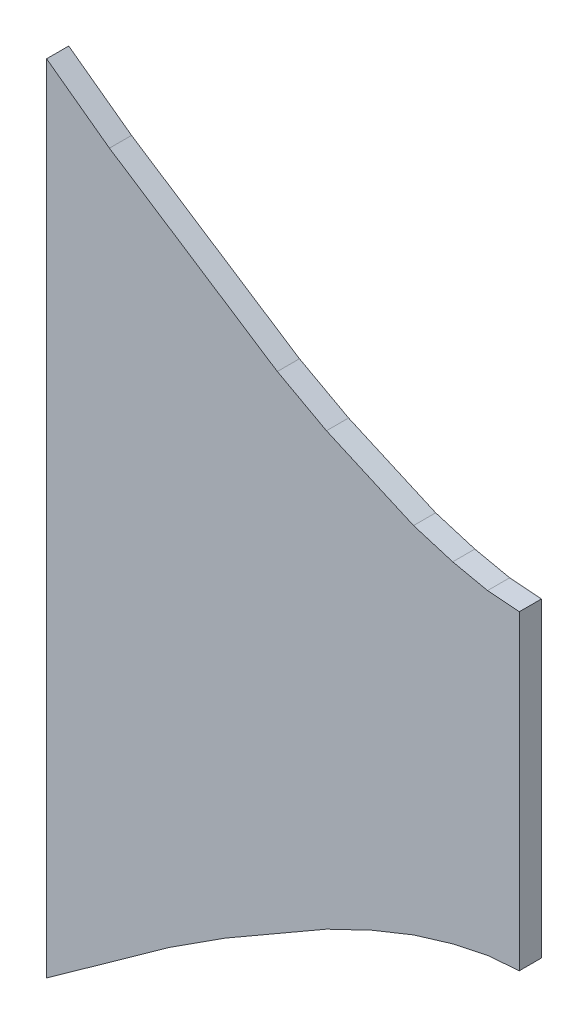
ISO-10303-21;
HEADER;
FILE_DESCRIPTION(('STEP AP214'),'2;1');
FILE_NAME('part.step','',(''),(''),'','','');
FILE_SCHEMA(('AUTOMOTIVE_DESIGN { 1 0 10303 214 1 1 1 1 }'));
ENDSEC;
DATA;
#1=APPLICATION_CONTEXT('core data for automotive mechanical design processes');
#2=APPLICATION_PROTOCOL_DEFINITION('international standard','automotive_design',2000,#1);
#3=PRODUCT_CONTEXT('',#1,'mechanical');
#4=PRODUCT('Part','Part','',(#3));
#5=PRODUCT_RELATED_PRODUCT_CATEGORY('part','',(#4));
#6=PRODUCT_DEFINITION_FORMATION('','',#4);
#7=PRODUCT_DEFINITION_CONTEXT('part definition',#1,'design');
#8=PRODUCT_DEFINITION('design','',#6,#7);
#9=PRODUCT_DEFINITION_SHAPE('','',#8);
#10=(LENGTH_UNIT() NAMED_UNIT(*) SI_UNIT(.MILLI.,.METRE.));
#11=(NAMED_UNIT(*) PLANE_ANGLE_UNIT() SI_UNIT($,.RADIAN.));
#12=(NAMED_UNIT(*) SI_UNIT($,.STERADIAN.) SOLID_ANGLE_UNIT());
#13=UNCERTAINTY_MEASURE_WITH_UNIT(LENGTH_MEASURE(1.E-05),#10,'distance_accuracy_value','');
#14=(GEOMETRIC_REPRESENTATION_CONTEXT(3) GLOBAL_UNCERTAINTY_ASSIGNED_CONTEXT((#13)) GLOBAL_UNIT_ASSIGNED_CONTEXT((#10,
#11,#12)) REPRESENTATION_CONTEXT('',''));
#15=CARTESIAN_POINT('',(0.,0.,0.));
#16=DIRECTION('',(0.,0.,1.));
#17=DIRECTION('',(1.,0.,0.));
#18=AXIS2_PLACEMENT_3D('',#15,#16,#17);
#19=CARTESIAN_POINT('',(88.6399993896484,88.25,0.));
#20=DIRECTION('',(-0.0781447450221444,-0.996942023803503,0.));
#21=DIRECTION('',(-0.996942023803503,0.0781447450221444,0.));
#22=AXIS2_PLACEMENT_3D('',#19,#20,#21);
#23=PLANE('',#22);
#24=DIRECTION('',(-0.996942023803503,0.0781447450221444,0.));
#25=VECTOR('',#24,1.);
#26=CARTESIAN_POINT('',(88.6399993896484,88.25,0.03556));
#27=LINE('',#26,#25);
#28=CARTESIAN_POINT('',(88.6399993896484,88.25,0.03556));
#29=VERTEX_POINT('',#28);
#30=CARTESIAN_POINT('',(88.588996887207,88.2539978027344,0.03556));
#31=VERTEX_POINT('',#30);
#32=EDGE_CURVE('E11',#29,#31,#27,.T.);
#33=ORIENTED_EDGE('',*,*,#32,.F.);
#34=DIRECTION('',(0.,0.,1.));
#35=VECTOR('',#34,1.);
#36=CARTESIAN_POINT('',(88.6399993896484,88.25,0.));
#37=LINE('',#36,#35);
#38=CARTESIAN_POINT('',(88.6399993896484,88.25,0.));
#39=VERTEX_POINT('',#38);
#40=EDGE_CURVE('E24',#39,#29,#37,.T.);
#41=ORIENTED_EDGE('',*,*,#40,.F.);
#42=DIRECTION('',(-0.996942023803503,0.0781447450221444,0.));
#43=VECTOR('',#42,1.);
#44=CARTESIAN_POINT('',(88.6399993896484,88.25,0.));
#45=LINE('',#44,#43);
#46=CARTESIAN_POINT('',(88.588996887207,88.2539978027344,0.));
#47=VERTEX_POINT('',#46);
#48=EDGE_CURVE('E154',#39,#47,#45,.T.);
#49=ORIENTED_EDGE('',*,*,#48,.T.);
#50=DIRECTION('',(0.,0.,1.));
#51=VECTOR('',#50,1.);
#52=CARTESIAN_POINT('',(88.588996887207,88.2539978027344,0.));
#53=LINE('',#52,#51);
#54=EDGE_CURVE('E37',#47,#31,#53,.T.);
#55=ORIENTED_EDGE('',*,*,#54,.T.);
#56=EDGE_LOOP('',(#33,#41,#49,#55));
#57=FACE_BOUND('',#56,.T.);
#58=ADVANCED_FACE('F17',(#57),#23,.F.);
#59=CARTESIAN_POINT('',(88.588996887207,88.2539978027344,0.));
#60=DIRECTION('',(-0.20954728392183,-0.977798514930854,0.));
#61=DIRECTION('',(-0.977798514930854,0.20954728392183,0.));
#62=AXIS2_PLACEMENT_3D('',#59,#60,#61);
#63=PLANE('',#62);
#64=DIRECTION('',(-0.977798514930854,0.20954728392183,0.));
#65=VECTOR('',#64,1.);
#66=CARTESIAN_POINT('',(88.588996887207,88.2539978027344,0.03556));
#67=LINE('',#66,#65);
#68=CARTESIAN_POINT('',(88.5329971313477,88.265998840332,0.03556));
#69=VERTEX_POINT('',#68);
#70=EDGE_CURVE('E266',#31,#69,#67,.T.);
#71=ORIENTED_EDGE('',*,*,#70,.F.);
#72=ORIENTED_EDGE('',*,*,#54,.F.);
#73=DIRECTION('',(-0.977798514930854,0.20954728392183,0.));
#74=VECTOR('',#73,1.);
#75=CARTESIAN_POINT('',(88.588996887207,88.2539978027344,0.));
#76=LINE('',#75,#74);
#77=CARTESIAN_POINT('',(88.5329971313477,88.265998840332,0.));
#78=VERTEX_POINT('',#77);
#79=EDGE_CURVE('E263',#47,#78,#76,.T.);
#80=ORIENTED_EDGE('',*,*,#79,.T.);
#81=DIRECTION('',(0.,0.,1.));
#82=VECTOR('',#81,1.);
#83=CARTESIAN_POINT('',(88.5329971313477,88.265998840332,0.));
#84=LINE('',#83,#82);
#85=EDGE_CURVE('E261',#78,#69,#84,.T.);
#86=ORIENTED_EDGE('',*,*,#85,.T.);
#87=EDGE_LOOP('',(#71,#72,#80,#86));
#88=FACE_BOUND('',#87,.T.);
#89=ADVANCED_FACE('F274',(#88),#63,.F.);
#90=CARTESIAN_POINT('',(88.5329971313477,88.265998840332,0.));
#91=DIRECTION('',(-0.288826144467003,-0.957381563574485,0.));
#92=DIRECTION('',(-0.957381563574485,0.288826144467003,0.));
#93=AXIS2_PLACEMENT_3D('',#90,#91,#92);
#94=PLANE('',#93);
#95=DIRECTION('',(-0.957381563574485,0.288826144467003,0.));
#96=VECTOR('',#95,1.);
#97=CARTESIAN_POINT('',(88.5329971313477,88.265998840332,0.03556));
#98=LINE('',#97,#96);
#99=CARTESIAN_POINT('',(88.4700012207031,88.2850036621094,0.03556));
#100=VERTEX_POINT('',#99);
#101=EDGE_CURVE('E258',#69,#100,#98,.T.);
#102=ORIENTED_EDGE('',*,*,#101,.F.);
#103=ORIENTED_EDGE('',*,*,#85,.F.);
#104=DIRECTION('',(-0.957381563574485,0.288826144467003,0.));
#105=VECTOR('',#104,1.);
#106=CARTESIAN_POINT('',(88.5329971313477,88.265998840332,0.));
#107=LINE('',#106,#105);
#108=CARTESIAN_POINT('',(88.4700012207031,88.2850036621094,0.));
#109=VERTEX_POINT('',#108);
#110=EDGE_CURVE('E255',#78,#109,#107,.T.);
#111=ORIENTED_EDGE('',*,*,#110,.T.);
#112=DIRECTION('',(0.,0.,1.));
#113=VECTOR('',#112,1.);
#114=CARTESIAN_POINT('',(88.4700012207031,88.2850036621094,0.));
#115=LINE('',#114,#113);
#116=EDGE_CURVE('E253',#109,#100,#115,.T.);
#117=ORIENTED_EDGE('',*,*,#116,.T.);
#118=EDGE_LOOP('',(#102,#103,#111,#117));
#119=FACE_BOUND('',#118,.T.);
#120=ADVANCED_FACE('F280',(#119),#94,.F.);
#121=CARTESIAN_POINT('',(88.4700012207031,88.2850036621094,0.));
#122=DIRECTION('',(-0.404908304527476,-0.914357296096381,0.));
#123=DIRECTION('',(-0.914357296096381,0.404908304527476,0.));
#124=AXIS2_PLACEMENT_3D('',#121,#122,#123);
#125=PLANE('',#124);
#126=DIRECTION('',(-0.914357296096381,0.404908304527476,0.));
#127=VECTOR('',#126,1.);
#128=CARTESIAN_POINT('',(88.4700012207031,88.2850036621094,0.03556));
#129=LINE('',#128,#127);
#130=CARTESIAN_POINT('',(88.3300018310547,88.3470001220703,0.03556));
#131=VERTEX_POINT('',#130);
#132=EDGE_CURVE('E250',#100,#131,#129,.T.);
#133=ORIENTED_EDGE('',*,*,#132,.F.);
#134=ORIENTED_EDGE('',*,*,#116,.F.);
#135=DIRECTION('',(-0.914357296096381,0.404908304527476,0.));
#136=VECTOR('',#135,1.);
#137=CARTESIAN_POINT('',(88.4700012207031,88.2850036621094,0.));
#138=LINE('',#137,#136);
#139=CARTESIAN_POINT('',(88.3300018310547,88.3470001220703,0.));
#140=VERTEX_POINT('',#139);
#141=EDGE_CURVE('E247',#109,#140,#138,.T.);
#142=ORIENTED_EDGE('',*,*,#141,.T.);
#143=DIRECTION('',(0.,0.,1.));
#144=VECTOR('',#143,1.);
#145=CARTESIAN_POINT('',(88.3300018310547,88.3470001220703,0.));
#146=LINE('',#145,#144);
#147=EDGE_CURVE('E245',#140,#131,#146,.T.);
#148=ORIENTED_EDGE('',*,*,#147,.T.);
#149=EDGE_LOOP('',(#133,#134,#142,#148));
#150=FACE_BOUND('',#149,.T.);
#151=ADVANCED_FACE('F282',(#150),#125,.F.);
#152=CARTESIAN_POINT('',(88.3300018310547,88.3470001220703,0.));
#153=DIRECTION('',(-0.478055581365163,-0.878329585705512,0.));
#154=DIRECTION('',(-0.878329585705512,0.478055581365163,0.));
#155=AXIS2_PLACEMENT_3D('',#152,#153,#154);
#156=PLANE('',#155);
#157=DIRECTION('',(-0.878329585705512,0.478055581365163,0.));
#158=VECTOR('',#157,1.);
#159=CARTESIAN_POINT('',(88.3300018310547,88.3470001220703,0.03556));
#160=LINE('',#159,#158);
#161=CARTESIAN_POINT('',(88.2509994506836,88.3899993896484,0.03556));
#162=VERTEX_POINT('',#161);
#163=EDGE_CURVE('E242',#131,#162,#160,.T.);
#164=ORIENTED_EDGE('',*,*,#163,.F.);
#165=ORIENTED_EDGE('',*,*,#147,.F.);
#166=DIRECTION('',(-0.878329585705512,0.478055581365163,0.));
#167=VECTOR('',#166,1.);
#168=CARTESIAN_POINT('',(88.3300018310547,88.3470001220703,0.));
#169=LINE('',#168,#167);
#170=CARTESIAN_POINT('',(88.2509994506836,88.3899993896484,0.));
#171=VERTEX_POINT('',#170);
#172=EDGE_CURVE('E239',#140,#171,#169,.T.);
#173=ORIENTED_EDGE('',*,*,#172,.T.);
#174=DIRECTION('',(0.,0.,1.));
#175=VECTOR('',#174,1.);
#176=CARTESIAN_POINT('',(88.2509994506836,88.3899993896484,0.));
#177=LINE('',#176,#175);
#178=EDGE_CURVE('E237',#171,#162,#177,.T.);
#179=ORIENTED_EDGE('',*,*,#178,.T.);
#180=EDGE_LOOP('',(#164,#165,#173,#179));
#181=FACE_BOUND('',#180,.T.);
#182=ADVANCED_FACE('F287',(#181),#156,.F.);
#183=CARTESIAN_POINT('',(88.2509994506836,88.3899993896484,0.));
#184=DIRECTION('',(-0.546088689918585,-0.837727367789189,0.));
#185=DIRECTION('',(-0.837727367789189,0.546088689918585,0.));
#186=AXIS2_PLACEMENT_3D('',#183,#184,#185);
#187=PLANE('',#186);
#188=DIRECTION('',(-0.837727367789189,0.546088689918585,0.));
#189=VECTOR('',#188,1.);
#190=CARTESIAN_POINT('',(88.2509994506836,88.3899993896484,0.03556));
#191=LINE('',#190,#189);
#192=CARTESIAN_POINT('',(87.9810028076172,88.5660018920898,0.03556));
#193=VERTEX_POINT('',#192);
#194=EDGE_CURVE('E234',#162,#193,#191,.T.);
#195=ORIENTED_EDGE('',*,*,#194,.F.);
#196=ORIENTED_EDGE('',*,*,#178,.F.);
#197=DIRECTION('',(-0.837727367789189,0.546088689918585,0.));
#198=VECTOR('',#197,1.);
#199=CARTESIAN_POINT('',(88.2509994506836,88.3899993896484,0.));
#200=LINE('',#199,#198);
#201=CARTESIAN_POINT('',(87.9810028076172,88.5660018920898,0.));
#202=VERTEX_POINT('',#201);
#203=EDGE_CURVE('E231',#171,#202,#200,.T.);
#204=ORIENTED_EDGE('',*,*,#203,.T.);
#205=DIRECTION('',(0.,0.,1.));
#206=VECTOR('',#205,1.);
#207=CARTESIAN_POINT('',(87.9810028076172,88.5660018920898,0.));
#208=LINE('',#207,#206);
#209=EDGE_CURVE('E229',#202,#193,#208,.T.);
#210=ORIENTED_EDGE('',*,*,#209,.T.);
#211=EDGE_LOOP('',(#195,#196,#204,#210));
#212=FACE_BOUND('',#211,.T.);
#213=ADVANCED_FACE('F290',(#212),#187,.F.);
#214=CARTESIAN_POINT('',(87.9810028076172,88.5660018920899,0.));
#215=DIRECTION('',(-0.590983210687128,-0.806683856715835,0.));
#216=DIRECTION('',(-0.806683856715835,0.590983210687128,0.));
#217=AXIS2_PLACEMENT_3D('',#214,#215,#216);
#218=PLANE('',#217);
#219=DIRECTION('',(-0.806683856715835,0.590983210687128,0.));
#220=VECTOR('',#219,1.);
#221=CARTESIAN_POINT('',(87.9810028076172,88.5660018920898,0.03556));
#222=LINE('',#221,#220);
#223=CARTESIAN_POINT('',(87.879997253418,88.6399993896484,0.03556));
#224=VERTEX_POINT('',#223);
#225=EDGE_CURVE('E226',#193,#224,#222,.T.);
#226=ORIENTED_EDGE('',*,*,#225,.F.);
#227=ORIENTED_EDGE('',*,*,#209,.F.);
#228=DIRECTION('',(-0.806683856715835,0.590983210687128,0.));
#229=VECTOR('',#228,1.);
#230=CARTESIAN_POINT('',(87.9810028076172,88.5660018920898,0.));
#231=LINE('',#230,#229);
#232=CARTESIAN_POINT('',(87.879997253418,88.6399993896484,0.));
#233=VERTEX_POINT('',#232);
#234=EDGE_CURVE('E223',#202,#233,#231,.T.);
#235=ORIENTED_EDGE('',*,*,#234,.T.);
#236=DIRECTION('',(0.,0.,1.));
#237=VECTOR('',#236,1.);
#238=CARTESIAN_POINT('',(87.879997253418,88.6399993896484,0.));
#239=LINE('',#238,#237);
#240=EDGE_CURVE('E221',#233,#224,#239,.T.);
#241=ORIENTED_EDGE('',*,*,#240,.T.);
#242=EDGE_LOOP('',(#226,#227,#235,#241));
#243=FACE_BOUND('',#242,.T.);
#244=ADVANCED_FACE('F295',(#243),#218,.F.);
#245=CARTESIAN_POINT('',(87.879997253418,88.6399993896484,0.));
#246=DIRECTION('',(1.,0.,0.));
#247=DIRECTION('',(0.,-1.,0.));
#248=AXIS2_PLACEMENT_3D('',#245,#246,#247);
#249=PLANE('',#248);
#250=DIRECTION('',(0.,-1.,0.));
#251=VECTOR('',#250,1.);
#252=CARTESIAN_POINT('',(87.879997253418,88.6399993896484,0.03556));
#253=LINE('',#252,#251);
#254=CARTESIAN_POINT('',(87.879997253418,87.3600006103516,0.03556));
#255=VERTEX_POINT('',#254);
#256=EDGE_CURVE('E218',#224,#255,#253,.T.);
#257=ORIENTED_EDGE('',*,*,#256,.F.);
#258=ORIENTED_EDGE('',*,*,#240,.F.);
#259=DIRECTION('',(0.,-1.,0.));
#260=VECTOR('',#259,1.);
#261=CARTESIAN_POINT('',(87.879997253418,88.6399993896484,0.));
#262=LINE('',#261,#260);
#263=CARTESIAN_POINT('',(87.879997253418,87.3600006103516,0.));
#264=VERTEX_POINT('',#263);
#265=EDGE_CURVE('E215',#233,#264,#262,.T.);
#266=ORIENTED_EDGE('',*,*,#265,.T.);
#267=DIRECTION('',(0.,0.,1.));
#268=VECTOR('',#267,1.);
#269=CARTESIAN_POINT('',(87.879997253418,87.3600006103516,0.));
#270=LINE('',#269,#268);
#271=EDGE_CURVE('E213',#264,#255,#270,.T.);
#272=ORIENTED_EDGE('',*,*,#271,.T.);
#273=EDGE_LOOP('',(#257,#258,#266,#272));
#274=FACE_BOUND('',#273,.T.);
#275=ADVANCED_FACE('F298',(#274),#249,.F.);
#276=CARTESIAN_POINT('',(87.879997253418,87.3600006103516,0.));
#277=DIRECTION('',(-0.582003532363586,0.813186256841757,0.));
#278=DIRECTION('',(0.813186256841757,0.582003532363586,0.));
#279=AXIS2_PLACEMENT_3D('',#276,#277,#278);
#280=PLANE('',#279);
#281=DIRECTION('',(0.813186256841757,0.582003532363586,0.));
#282=VECTOR('',#281,1.);
#283=CARTESIAN_POINT('',(87.879997253418,87.3600006103516,0.03556));
#284=LINE('',#283,#282);
#285=CARTESIAN_POINT('',(88.0770034790039,87.5009994506836,0.03556));
#286=VERTEX_POINT('',#285);
#287=EDGE_CURVE('E210',#255,#286,#284,.T.);
#288=ORIENTED_EDGE('',*,*,#287,.F.);
#289=ORIENTED_EDGE('',*,*,#271,.F.);
#290=DIRECTION('',(0.813186256841757,0.582003532363586,0.));
#291=VECTOR('',#290,1.);
#292=CARTESIAN_POINT('',(87.879997253418,87.3600006103516,0.));
#293=LINE('',#292,#291);
#294=CARTESIAN_POINT('',(88.0770034790039,87.5009994506836,0.));
#295=VERTEX_POINT('',#294);
#296=EDGE_CURVE('E207',#264,#295,#293,.T.);
#297=ORIENTED_EDGE('',*,*,#296,.T.);
#298=DIRECTION('',(0.,0.,1.));
#299=VECTOR('',#298,1.);
#300=CARTESIAN_POINT('',(88.0770034790039,87.5009994506836,0.));
#301=LINE('',#300,#299);
#302=EDGE_CURVE('E205',#295,#286,#301,.T.);
#303=ORIENTED_EDGE('',*,*,#302,.T.);
#304=EDGE_LOOP('',(#288,#289,#297,#303));
#305=FACE_BOUND('',#304,.T.);
#306=ADVANCED_FACE('F303',(#305),#280,.F.);
#307=CARTESIAN_POINT('',(88.0770034790039,87.5009994506836,0.));
#308=DIRECTION('',(-0.541708046838841,0.840566708828067,0.));
#309=DIRECTION('',(0.840566708828067,0.541708046838841,0.));
#310=AXIS2_PLACEMENT_3D('',#307,#308,#309);
#311=PLANE('',#310);
#312=DIRECTION('',(0.840566708828067,0.541708046838841,0.));
#313=VECTOR('',#312,1.);
#314=CARTESIAN_POINT('',(88.0770034790039,87.5009994506836,0.03556));
#315=LINE('',#314,#313);
#316=CARTESIAN_POINT('',(88.1669998168945,87.5589981079101,0.03556));
#317=VERTEX_POINT('',#316);
#318=EDGE_CURVE('E202',#286,#317,#315,.T.);
#319=ORIENTED_EDGE('',*,*,#318,.F.);
#320=ORIENTED_EDGE('',*,*,#302,.F.);
#321=DIRECTION('',(0.840566708828067,0.541708046838841,0.));
#322=VECTOR('',#321,1.);
#323=CARTESIAN_POINT('',(88.0770034790039,87.5009994506836,0.));
#324=LINE('',#323,#322);
#325=CARTESIAN_POINT('',(88.1669998168945,87.5589981079101,0.));
#326=VERTEX_POINT('',#325);
#327=EDGE_CURVE('E199',#295,#326,#324,.T.);
#328=ORIENTED_EDGE('',*,*,#327,.T.);
#329=DIRECTION('',(0.,0.,1.));
#330=VECTOR('',#329,1.);
#331=CARTESIAN_POINT('',(88.1669998168945,87.5589981079101,0.));
#332=LINE('',#331,#330);
#333=EDGE_CURVE('E197',#326,#317,#332,.T.);
#334=ORIENTED_EDGE('',*,*,#333,.T.);
#335=EDGE_LOOP('',(#319,#320,#328,#334));
#336=FACE_BOUND('',#335,.T.);
#337=ADVANCED_FACE('F306',(#336),#311,.F.);
#338=CARTESIAN_POINT('',(88.1669998168945,87.5589981079101,0.));
#339=DIRECTION('',(-0.49957151089777,0.866272650785721,0.));
#340=DIRECTION('',(0.866272650785721,0.49957151089777,0.));
#341=AXIS2_PLACEMENT_3D('',#338,#339,#340);
#342=PLANE('',#341);
#343=DIRECTION('',(0.866272650785721,0.49957151089777,0.));
#344=VECTOR('',#343,1.);
#345=CARTESIAN_POINT('',(88.1669998168945,87.5589981079101,0.03556));
#346=LINE('',#345,#344);
#347=CARTESIAN_POINT('',(88.3300018310547,87.6529998779297,0.03556));
#348=VERTEX_POINT('',#347);
#349=EDGE_CURVE('E194',#317,#348,#346,.T.);
#350=ORIENTED_EDGE('',*,*,#349,.F.);
#351=ORIENTED_EDGE('',*,*,#333,.F.);
#352=DIRECTION('',(0.866272650785721,0.49957151089777,0.));
#353=VECTOR('',#352,1.);
#354=CARTESIAN_POINT('',(88.1669998168945,87.5589981079101,0.));
#355=LINE('',#354,#353);
#356=CARTESIAN_POINT('',(88.3300018310547,87.6529998779297,0.));
#357=VERTEX_POINT('',#356);
#358=EDGE_CURVE('E191',#326,#357,#355,.T.);
#359=ORIENTED_EDGE('',*,*,#358,.T.);
#360=DIRECTION('',(0.,0.,1.));
#361=VECTOR('',#360,1.);
#362=CARTESIAN_POINT('',(88.3300018310547,87.6529998779297,0.));
#363=LINE('',#362,#361);
#364=EDGE_CURVE('E189',#357,#348,#363,.T.);
#365=ORIENTED_EDGE('',*,*,#364,.T.);
#366=EDGE_LOOP('',(#350,#351,#359,#365));
#367=FACE_BOUND('',#366,.T.);
#368=ADVANCED_FACE('F311',(#367),#342,.F.);
#369=CARTESIAN_POINT('',(88.3300018310547,87.6529998779297,0.));
#370=DIRECTION('',(-0.432375640471323,0.901693576292419,0.));
#371=DIRECTION('',(0.901693576292419,0.432375640471323,0.));
#372=AXIS2_PLACEMENT_3D('',#369,#370,#371);
#373=PLANE('',#372);
#374=DIRECTION('',(0.901693576292419,0.432375640471323,0.));
#375=VECTOR('',#374,1.);
#376=CARTESIAN_POINT('',(88.3300018310547,87.6529998779297,0.03556));
#377=LINE('',#376,#375);
#378=CARTESIAN_POINT('',(88.4029998779297,87.6880035400391,0.03556));
#379=VERTEX_POINT('',#378);
#380=EDGE_CURVE('E186',#348,#379,#377,.T.);
#381=ORIENTED_EDGE('',*,*,#380,.F.);
#382=ORIENTED_EDGE('',*,*,#364,.F.);
#383=DIRECTION('',(0.901693576292419,0.432375640471323,0.));
#384=VECTOR('',#383,1.);
#385=CARTESIAN_POINT('',(88.3300018310547,87.6529998779297,0.));
#386=LINE('',#385,#384);
#387=CARTESIAN_POINT('',(88.4029998779297,87.6880035400391,0.));
#388=VERTEX_POINT('',#387);
#389=EDGE_CURVE('E183',#357,#388,#386,.T.);
#390=ORIENTED_EDGE('',*,*,#389,.T.);
#391=DIRECTION('',(0.,0.,1.));
#392=VECTOR('',#391,1.);
#393=CARTESIAN_POINT('',(88.4029998779297,87.6880035400391,0.));
#394=LINE('',#393,#392);
#395=EDGE_CURVE('E181',#388,#379,#394,.T.);
#396=ORIENTED_EDGE('',*,*,#395,.T.);
#397=EDGE_LOOP('',(#381,#382,#390,#396));
#398=FACE_BOUND('',#397,.T.);
#399=ADVANCED_FACE('F314',(#398),#373,.F.);
#400=CARTESIAN_POINT('',(88.4029998779297,87.6880035400391,0.));
#401=DIRECTION('',(-0.373684048737633,0.927556053141292,0.));
#402=DIRECTION('',(0.927556053141292,0.373684048737633,0.));
#403=AXIS2_PLACEMENT_3D('',#400,#401,#402);
#404=PLANE('',#403);
#405=DIRECTION('',(0.927556053141292,0.373684048737633,0.));
#406=VECTOR('',#405,1.);
#407=CARTESIAN_POINT('',(88.4029998779297,87.6880035400391,0.03556));
#408=LINE('',#407,#406);
#409=CARTESIAN_POINT('',(88.4700012207031,87.7149963378906,0.03556));
#410=VERTEX_POINT('',#409);
#411=EDGE_CURVE('E178',#379,#410,#408,.T.);
#412=ORIENTED_EDGE('',*,*,#411,.F.);
#413=ORIENTED_EDGE('',*,*,#395,.F.);
#414=DIRECTION('',(0.927556053141292,0.373684048737633,0.));
#415=VECTOR('',#414,1.);
#416=CARTESIAN_POINT('',(88.4029998779297,87.6880035400391,0.));
#417=LINE('',#416,#415);
#418=CARTESIAN_POINT('',(88.4700012207031,87.7149963378906,0.));
#419=VERTEX_POINT('',#418);
#420=EDGE_CURVE('E175',#388,#419,#417,.T.);
#421=ORIENTED_EDGE('',*,*,#420,.T.);
#422=DIRECTION('',(0.,0.,1.));
#423=VECTOR('',#422,1.);
#424=CARTESIAN_POINT('',(88.4700012207031,87.7149963378906,0.));
#425=LINE('',#424,#423);
#426=EDGE_CURVE('E173',#419,#410,#425,.T.);
#427=ORIENTED_EDGE('',*,*,#426,.T.);
#428=EDGE_LOOP('',(#412,#413,#421,#427));
#429=FACE_BOUND('',#428,.T.);
#430=ADVANCED_FACE('F319',(#429),#404,.F.);
#431=CARTESIAN_POINT('',(88.4700012207031,87.7149963378906,0.));
#432=DIRECTION('',(-0.288826144467003,0.957381563574485,0.));
#433=DIRECTION('',(0.957381563574485,0.288826144467003,0.));
#434=AXIS2_PLACEMENT_3D('',#431,#432,#433);
#435=PLANE('',#434);
#436=DIRECTION('',(0.957381563574485,0.288826144467003,0.));
#437=VECTOR('',#436,1.);
#438=CARTESIAN_POINT('',(88.4700012207031,87.7149963378906,0.03556));
#439=LINE('',#438,#437);
#440=CARTESIAN_POINT('',(88.5329971313477,87.734001159668,0.03556));
#441=VERTEX_POINT('',#440);
#442=EDGE_CURVE('E170',#410,#441,#439,.T.);
#443=ORIENTED_EDGE('',*,*,#442,.F.);
#444=ORIENTED_EDGE('',*,*,#426,.F.);
#445=DIRECTION('',(0.957381563574485,0.288826144467003,0.));
#446=VECTOR('',#445,1.);
#447=CARTESIAN_POINT('',(88.4700012207031,87.7149963378906,0.));
#448=LINE('',#447,#446);
#449=CARTESIAN_POINT('',(88.5329971313477,87.734001159668,0.));
#450=VERTEX_POINT('',#449);
#451=EDGE_CURVE('E167',#419,#450,#448,.T.);
#452=ORIENTED_EDGE('',*,*,#451,.T.);
#453=DIRECTION('',(0.,0.,1.));
#454=VECTOR('',#453,1.);
#455=CARTESIAN_POINT('',(88.5329971313477,87.734001159668,0.));
#456=LINE('',#455,#454);
#457=EDGE_CURVE('E165',#450,#441,#456,.T.);
#458=ORIENTED_EDGE('',*,*,#457,.T.);
#459=EDGE_LOOP('',(#443,#444,#452,#458));
#460=FACE_BOUND('',#459,.T.);
#461=ADVANCED_FACE('F322',(#460),#435,.F.);
#462=CARTESIAN_POINT('',(88.5329971313477,87.734001159668,0.));
#463=DIRECTION('',(-0.20954728392183,0.977798514930854,0.));
#464=DIRECTION('',(0.977798514930854,0.20954728392183,0.));
#465=AXIS2_PLACEMENT_3D('',#462,#463,#464);
#466=PLANE('',#465);
#467=DIRECTION('',(0.977798514930854,0.20954728392183,0.));
#468=VECTOR('',#467,1.);
#469=CARTESIAN_POINT('',(88.5329971313477,87.734001159668,0.03556));
#470=LINE('',#469,#468);
#471=CARTESIAN_POINT('',(88.588996887207,87.7460021972656,0.03556));
#472=VERTEX_POINT('',#471);
#473=EDGE_CURVE('E162',#441,#472,#470,.T.);
#474=ORIENTED_EDGE('',*,*,#473,.F.);
#475=ORIENTED_EDGE('',*,*,#457,.F.);
#476=DIRECTION('',(0.977798514930854,0.20954728392183,0.));
#477=VECTOR('',#476,1.);
#478=CARTESIAN_POINT('',(88.5329971313477,87.734001159668,0.));
#479=LINE('',#478,#477);
#480=CARTESIAN_POINT('',(88.588996887207,87.7460021972656,0.));
#481=VERTEX_POINT('',#480);
#482=EDGE_CURVE('E160',#450,#481,#479,.T.);
#483=ORIENTED_EDGE('',*,*,#482,.T.);
#484=DIRECTION('',(0.,0.,1.));
#485=VECTOR('',#484,1.);
#486=CARTESIAN_POINT('',(88.588996887207,87.7460021972656,0.));
#487=LINE('',#486,#485);
#488=EDGE_CURVE('E145',#481,#472,#487,.T.);
#489=ORIENTED_EDGE('',*,*,#488,.T.);
#490=EDGE_LOOP('',(#474,#475,#483,#489));
#491=FACE_BOUND('',#490,.T.);
#492=ADVANCED_FACE('F325',(#491),#466,.F.);
#493=CARTESIAN_POINT('',(88.588996887207,87.7460021972656,0.));
#494=DIRECTION('',(-0.0781447450221444,0.996942023803503,0.));
#495=DIRECTION('',(0.996942023803503,0.0781447450221444,0.));
#496=AXIS2_PLACEMENT_3D('',#493,#494,#495);
#497=PLANE('',#496);
#498=DIRECTION('',(0.996942023803503,0.0781447450221444,0.));
#499=VECTOR('',#498,1.);
#500=CARTESIAN_POINT('',(88.588996887207,87.7460021972656,0.03556));
#501=LINE('',#500,#499);
#502=CARTESIAN_POINT('',(88.6399993896484,87.75,0.03556));
#503=VERTEX_POINT('',#502);
#504=EDGE_CURVE('E149',#472,#503,#501,.T.);
#505=ORIENTED_EDGE('',*,*,#504,.F.);
#506=ORIENTED_EDGE('',*,*,#488,.F.);
#507=DIRECTION('',(0.996942023803503,0.0781447450221444,0.));
#508=VECTOR('',#507,1.);
#509=CARTESIAN_POINT('',(88.588996887207,87.7460021972656,0.));
#510=LINE('',#509,#508);
#511=CARTESIAN_POINT('',(88.6399993896484,87.75,0.));
#512=VERTEX_POINT('',#511);
#513=EDGE_CURVE('E141',#481,#512,#510,.T.);
#514=ORIENTED_EDGE('',*,*,#513,.T.);
#515=DIRECTION('',(0.,0.,1.));
#516=VECTOR('',#515,1.);
#517=CARTESIAN_POINT('',(88.6399993896484,87.75,0.));
#518=LINE('',#517,#516);
#519=EDGE_CURVE('E131',#512,#503,#518,.T.);
#520=ORIENTED_EDGE('',*,*,#519,.T.);
#521=EDGE_LOOP('',(#505,#506,#514,#520));
#522=FACE_BOUND('',#521,.T.);
#523=ADVANCED_FACE('F144',(#522),#497,.F.);
#524=CARTESIAN_POINT('',(88.6399993896484,87.75,0.));
#525=DIRECTION('',(-1.,0.,0.));
#526=DIRECTION('',(0.,1.,0.));
#527=AXIS2_PLACEMENT_3D('',#524,#525,#526);
#528=PLANE('',#527);
#529=DIRECTION('',(0.,1.,0.));
#530=VECTOR('',#529,1.);
#531=CARTESIAN_POINT('',(88.6399993896484,87.75,0.03556));
#532=LINE('',#531,#530);
#533=EDGE_CURVE('E137',#503,#29,#532,.T.);
#534=ORIENTED_EDGE('',*,*,#533,.F.);
#535=ORIENTED_EDGE('',*,*,#519,.F.);
#536=DIRECTION('',(0.,1.,0.));
#537=VECTOR('',#536,1.);
#538=CARTESIAN_POINT('',(88.6399993896484,87.75,0.));
#539=LINE('',#538,#537);
#540=EDGE_CURVE('E135',#512,#39,#539,.T.);
#541=ORIENTED_EDGE('',*,*,#540,.T.);
#542=ORIENTED_EDGE('',*,*,#40,.T.);
#543=EDGE_LOOP('',(#534,#535,#541,#542));
#544=FACE_BOUND('',#543,.T.);
#545=ADVANCED_FACE('F133',(#544),#528,.F.);
#546=CARTESIAN_POINT('',(88.6399993896484,88.25,0.));
#547=DIRECTION('',(0.,0.,1.));
#548=DIRECTION('',(1.,0.,0.));
#549=AXIS2_PLACEMENT_3D('',#546,#547,#548);
#550=PLANE('',#549);
#551=ORIENTED_EDGE('',*,*,#540,.F.);
#552=ORIENTED_EDGE('',*,*,#513,.F.);
#553=ORIENTED_EDGE('',*,*,#482,.F.);
#554=ORIENTED_EDGE('',*,*,#451,.F.);
#555=ORIENTED_EDGE('',*,*,#420,.F.);
#556=ORIENTED_EDGE('',*,*,#389,.F.);
#557=ORIENTED_EDGE('',*,*,#358,.F.);
#558=ORIENTED_EDGE('',*,*,#327,.F.);
#559=ORIENTED_EDGE('',*,*,#296,.F.);
#560=ORIENTED_EDGE('',*,*,#265,.F.);
#561=ORIENTED_EDGE('',*,*,#234,.F.);
#562=ORIENTED_EDGE('',*,*,#203,.F.);
#563=ORIENTED_EDGE('',*,*,#172,.F.);
#564=ORIENTED_EDGE('',*,*,#141,.F.);
#565=ORIENTED_EDGE('',*,*,#110,.F.);
#566=ORIENTED_EDGE('',*,*,#79,.F.);
#567=ORIENTED_EDGE('',*,*,#48,.F.);
#568=EDGE_LOOP('',(#551,#552,#553,#554,#555,#556,#557,#558,#559,#560,#561,#562,#563,#564,#565,
#566,#567));
#569=FACE_BOUND('',#568,.T.);
#570=ADVANCED_FACE('F152',(#569),#550,.F.);
#571=CARTESIAN_POINT('',(88.6399993896484,88.25,0.03556));
#572=DIRECTION('',(0.,0.,1.));
#573=DIRECTION('',(1.,0.,0.));
#574=AXIS2_PLACEMENT_3D('',#571,#572,#573);
#575=PLANE('',#574);
#576=ORIENTED_EDGE('',*,*,#32,.T.);
#577=ORIENTED_EDGE('',*,*,#70,.T.);
#578=ORIENTED_EDGE('',*,*,#101,.T.);
#579=ORIENTED_EDGE('',*,*,#132,.T.);
#580=ORIENTED_EDGE('',*,*,#163,.T.);
#581=ORIENTED_EDGE('',*,*,#194,.T.);
#582=ORIENTED_EDGE('',*,*,#225,.T.);
#583=ORIENTED_EDGE('',*,*,#256,.T.);
#584=ORIENTED_EDGE('',*,*,#287,.T.);
#585=ORIENTED_EDGE('',*,*,#318,.T.);
#586=ORIENTED_EDGE('',*,*,#349,.T.);
#587=ORIENTED_EDGE('',*,*,#380,.T.);
#588=ORIENTED_EDGE('',*,*,#411,.T.);
#589=ORIENTED_EDGE('',*,*,#442,.T.);
#590=ORIENTED_EDGE('',*,*,#473,.T.);
#591=ORIENTED_EDGE('',*,*,#504,.T.);
#592=ORIENTED_EDGE('',*,*,#533,.T.);
#593=EDGE_LOOP('',(#576,#577,#578,#579,#580,#581,#582,#583,#584,#585,#586,#587,#588,#589,#590,
#591,#592));
#594=FACE_BOUND('',#593,.T.);
#595=ADVANCED_FACE('F277',(#594),#575,.T.);
#596=CLOSED_SHELL('',(#58,#89,#120,#151,#182,#213,#244,#275,#306,#337,#368,#399,#430,#461,#492,
#523,#545,#570,#595));
#597=MANIFOLD_SOLID_BREP('B1',#596);
#598=ADVANCED_BREP_SHAPE_REPRESENTATION('',(#18,#597),#14);
#599=SHAPE_DEFINITION_REPRESENTATION(#9,#598);
ENDSEC;
END-ISO-10303-21;
